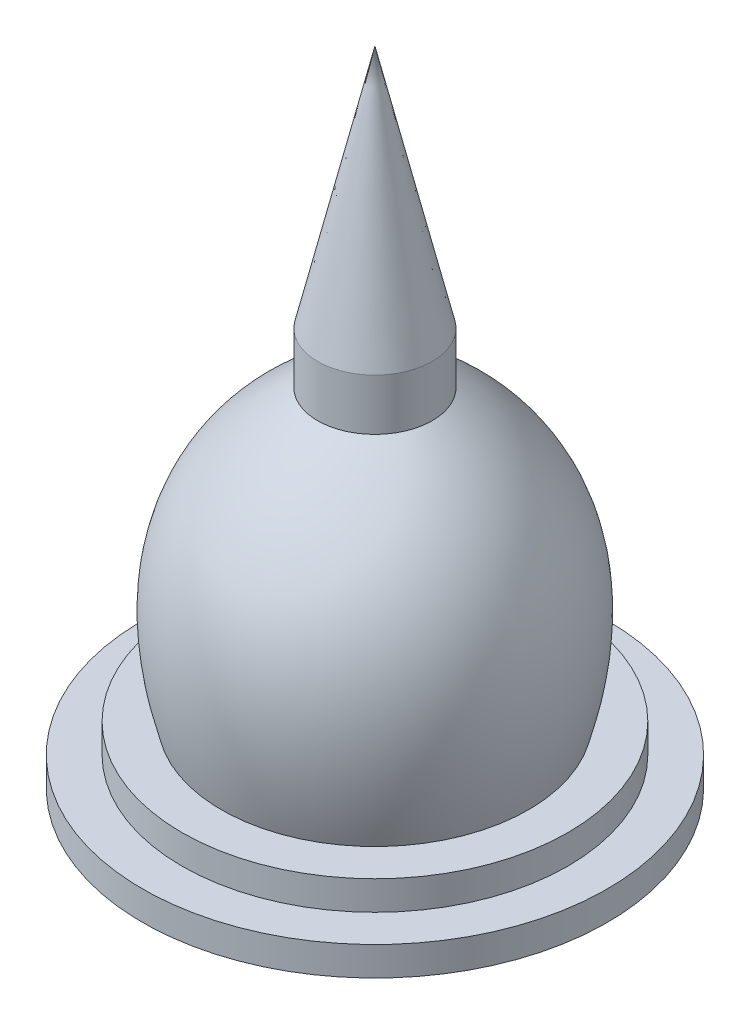
ISO-10303-21;
HEADER;
FILE_DESCRIPTION(('STEP AP214'),'2;1');
FILE_NAME('part.step','',(''),(''),'','','');
FILE_SCHEMA(('AUTOMOTIVE_DESIGN { 1 0 10303 214 1 1 1 1 }'));
ENDSEC;
DATA;
#1=APPLICATION_CONTEXT('core data for automotive mechanical design processes');
#2=APPLICATION_PROTOCOL_DEFINITION('international standard','automotive_design',2000,#1);
#3=PRODUCT_CONTEXT('',#1,'mechanical');
#4=PRODUCT('Part','Part','',(#3));
#5=PRODUCT_RELATED_PRODUCT_CATEGORY('part','',(#4));
#6=PRODUCT_DEFINITION_FORMATION('','',#4);
#7=PRODUCT_DEFINITION_CONTEXT('part definition',#1,'design');
#8=PRODUCT_DEFINITION('design','',#6,#7);
#9=PRODUCT_DEFINITION_SHAPE('','',#8);
#10=(LENGTH_UNIT() NAMED_UNIT(*) SI_UNIT(.MILLI.,.METRE.));
#11=(NAMED_UNIT(*) PLANE_ANGLE_UNIT() SI_UNIT($,.RADIAN.));
#12=(NAMED_UNIT(*) SI_UNIT($,.STERADIAN.) SOLID_ANGLE_UNIT());
#13=UNCERTAINTY_MEASURE_WITH_UNIT(LENGTH_MEASURE(1.E-05),#10,'distance_accuracy_value','');
#14=(GEOMETRIC_REPRESENTATION_CONTEXT(3) GLOBAL_UNCERTAINTY_ASSIGNED_CONTEXT((#13)) GLOBAL_UNIT_ASSIGNED_CONTEXT((#10,
#11,#12)) REPRESENTATION_CONTEXT('',''));
#15=CARTESIAN_POINT('',(0.,0.,0.));
#16=DIRECTION('',(0.,0.,1.));
#17=DIRECTION('',(1.,0.,0.));
#18=AXIS2_PLACEMENT_3D('',#15,#16,#17);
#19=CARTESIAN_POINT('',(-118.909502295578,-31.4918005815589,6.90444602269268E-05));
#20=CARTESIAN_POINT('',(-161.528042418388,117.899725874053,6.90444602269268E-05));
#21=CARTESIAN_POINT('',(-44.4234505234384,192.284239628368,6.90444602269268E-05));
#22=B_SPLINE_CURVE_WITH_KNOTS('',2,(#19,#20,#21),.UNSPECIFIED.,.F.,.F.,(3,3),(0.,1.),.UNSPECIFIED.);
#23=CARTESIAN_POINT('',(0.,-76.502097549297,6.90444602269268E-05));
#24=DIRECTION('',(0.,-1.,0.));
#25=AXIS1_PLACEMENT('',#23,#24);
#26=SURFACE_OF_REVOLUTION('',#22,#25);
#27=CARTESIAN_POINT('',(0.,192.284239628368,6.90444602269268E-05));
#28=DIRECTION('',(0.,-1.,0.));
#29=DIRECTION('',(0.,0.,-1.));
#30=AXIS2_PLACEMENT_3D('',#27,#28,#29);
#31=CIRCLE('',#30,44.4234505234384);
#32=CARTESIAN_POINT('',(0.,192.284239628368,-44.4233814789782));
#33=VERTEX_POINT('',#32);
#34=EDGE_CURVE('E59',#33,#33,#31,.T.);
#35=ORIENTED_EDGE('',*,*,#34,.T.);
#36=EDGE_LOOP('',(#35));
#37=FACE_BOUND('',#36,.T.);
#38=CARTESIAN_POINT('',(0.,-31.4918005815589,6.90444602269268E-05));
#39=DIRECTION('',(0.,-1.,0.));
#40=DIRECTION('',(0.,0.,-1.));
#41=AXIS2_PLACEMENT_3D('',#38,#39,#40);
#42=CIRCLE('',#41,118.909502295578);
#43=CARTESIAN_POINT('',(0.,-31.4918005815589,-118.909433251118));
#44=VERTEX_POINT('',#43);
#45=EDGE_CURVE('E11',#44,#44,#42,.T.);
#46=ORIENTED_EDGE('',*,*,#45,.F.);
#47=EDGE_LOOP('',(#46));
#48=FACE_BOUND('',#47,.T.);
#49=ADVANCED_FACE('F38',(#37,#48),#26,.F.);
#50=CARTESIAN_POINT('',(0.,-31.4918005815589,6.90444602269268E-05));
#51=DIRECTION('',(0.,1.,0.));
#52=DIRECTION('',(0.,0.,1.));
#53=AXIS2_PLACEMENT_3D('',#50,#51,#52);
#54=PLANE('',#53);
#55=ORIENTED_EDGE('',*,*,#45,.T.);
#56=EDGE_LOOP('',(#55));
#57=FACE_BOUND('',#56,.T.);
#58=CARTESIAN_POINT('',(0.,-31.4918005815589,6.90444602269268E-05));
#59=DIRECTION('',(0.,-1.,0.));
#60=DIRECTION('',(0.,0.,-1.));
#61=AXIS2_PLACEMENT_3D('',#58,#59,#60);
#62=CIRCLE('',#61,149.45475124421);
#63=CARTESIAN_POINT('',(0.,-31.4918005815589,-149.45468219975));
#64=VERTEX_POINT('',#63);
#65=EDGE_CURVE('E45',#64,#64,#62,.T.);
#66=ORIENTED_EDGE('',*,*,#65,.F.);
#67=EDGE_LOOP('',(#66));
#68=FACE_BOUND('',#67,.T.);
#69=ADVANCED_FACE('F76',(#57,#68),#54,.T.);
#70=CARTESIAN_POINT('',(0.,-76.502097549297,6.90444602269268E-05));
#71=DIRECTION('',(0.,-1.,0.));
#72=DIRECTION('',(0.,0.,-1.));
#73=AXIS2_PLACEMENT_3D('',#70,#71,#72);
#74=CYLINDRICAL_SURFACE('',#73,149.45475124421);
#75=CARTESIAN_POINT('',(0.,-53.9952329041527,6.90444602269268E-05));
#76=DIRECTION('',(0.,-1.,0.));
#77=DIRECTION('',(0.,0.,-1.));
#78=AXIS2_PLACEMENT_3D('',#75,#76,#77);
#79=CIRCLE('',#78,149.45475124421);
#80=CARTESIAN_POINT('',(0.,-53.9952329041527,-149.45468219975));
#81=VERTEX_POINT('',#80);
#82=EDGE_CURVE('E69',#81,#81,#79,.T.);
#83=ORIENTED_EDGE('',*,*,#82,.F.);
#84=EDGE_LOOP('',(#83));
#85=FACE_BOUND('',#84,.T.);
#86=ORIENTED_EDGE('',*,*,#65,.T.);
#87=EDGE_LOOP('',(#86));
#88=FACE_BOUND('',#87,.T.);
#89=ADVANCED_FACE('F74',(#85,#88),#74,.T.);
#90=CARTESIAN_POINT('',(0.,-53.9952329041527,6.90444602269268E-05));
#91=DIRECTION('',(0.,-1.,0.));
#92=DIRECTION('',(0.,0.,-1.));
#93=AXIS2_PLACEMENT_3D('',#90,#91,#92);
#94=CONICAL_SURFACE('',#93,149.45475124421,1.57068395833578);
#95=CARTESIAN_POINT('',(0.,-53.9986652267032,6.90444602269268E-05));
#96=DIRECTION('',(0.,-1.,0.));
#97=DIRECTION('',(0.,0.,-1.));
#98=AXIS2_PLACEMENT_3D('',#95,#96,#97);
#99=CIRCLE('',#98,180.);
#100=CARTESIAN_POINT('',(0.,-53.9986652267032,-179.99993095554));
#101=VERTEX_POINT('',#100);
#102=EDGE_CURVE('E62',#101,#101,#99,.T.);
#103=ORIENTED_EDGE('',*,*,#102,.F.);
#104=EDGE_LOOP('',(#103));
#105=FACE_BOUND('',#104,.T.);
#106=ORIENTED_EDGE('',*,*,#82,.T.);
#107=EDGE_LOOP('',(#106));
#108=FACE_BOUND('',#107,.T.);
#109=ADVANCED_FACE('F83',(#105,#108),#94,.T.);
#110=CARTESIAN_POINT('',(0.,-76.502097549297,6.90444602269268E-05));
#111=DIRECTION('',(0.,-1.,0.));
#112=DIRECTION('',(0.,0.,-1.));
#113=AXIS2_PLACEMENT_3D('',#110,#111,#112);
#114=CYLINDRICAL_SURFACE('',#113,180.);
#115=ORIENTED_EDGE('',*,*,#102,.T.);
#116=EDGE_LOOP('',(#115));
#117=FACE_BOUND('',#116,.T.);
#118=CARTESIAN_POINT('',(0.,-76.502097549297,6.90444602269268E-05));
#119=DIRECTION('',(0.,-1.,0.));
#120=DIRECTION('',(0.,0.,-1.));
#121=AXIS2_PLACEMENT_3D('',#118,#119,#120);
#122=CIRCLE('',#121,180.);
#123=CARTESIAN_POINT('',(0.,-76.502097549297,-179.99993095554));
#124=VERTEX_POINT('',#123);
#125=EDGE_CURVE('E58',#124,#124,#122,.T.);
#126=ORIENTED_EDGE('',*,*,#125,.F.);
#127=EDGE_LOOP('',(#126));
#128=FACE_BOUND('',#127,.T.);
#129=ADVANCED_FACE('F91',(#117,#128),#114,.T.);
#130=CARTESIAN_POINT('',(0.,-76.502097549297,6.90444602269268E-05));
#131=DIRECTION('',(0.,-1.,0.));
#132=DIRECTION('',(0.,0.,-1.));
#133=AXIS2_PLACEMENT_3D('',#130,#131,#132);
#134=PLANE('',#133);
#135=ORIENTED_EDGE('',*,*,#125,.T.);
#136=EDGE_LOOP('',(#135));
#137=FACE_BOUND('',#136,.T.);
#138=ADVANCED_FACE('F52',(#137),#134,.T.);
#139=CARTESIAN_POINT('',(0.,232.069264862423,6.90444602269268E-05));
#140=DIRECTION('',(0.,-1.,0.));
#141=DIRECTION('',(0.,0.,-1.));
#142=AXIS2_PLACEMENT_3D('',#139,#140,#141);
#143=CONICAL_SURFACE('',#142,44.4234505234384,0.230440107254821);
#144=CARTESIAN_POINT('',(0.,421.421365571114,6.90444602269268E-05));
#145=VERTEX_POINT('',#144);
#146=VERTEX_LOOP('',#145);
#147=FACE_BOUND('',#146,.T.);
#148=CARTESIAN_POINT('',(0.,232.069264862423,6.90444602269268E-05));
#149=DIRECTION('',(0.,-1.,0.));
#150=DIRECTION('',(0.,0.,-1.));
#151=AXIS2_PLACEMENT_3D('',#148,#149,#150);
#152=CIRCLE('',#151,44.4234505234384);
#153=CARTESIAN_POINT('',(0.,232.069264862423,-44.4233814789782));
#154=VERTEX_POINT('',#153);
#155=EDGE_CURVE('E56',#154,#154,#152,.T.);
#156=ORIENTED_EDGE('',*,*,#155,.F.);
#157=EDGE_LOOP('',(#156));
#158=FACE_BOUND('',#157,.T.);
#159=ADVANCED_FACE('F48',(#147,#158),#143,.T.);
#160=CARTESIAN_POINT('',(0.,-76.502097549297,6.90444602269268E-05));
#161=DIRECTION('',(0.,-1.,0.));
#162=DIRECTION('',(0.,0.,-1.));
#163=AXIS2_PLACEMENT_3D('',#160,#161,#162);
#164=CYLINDRICAL_SURFACE('',#163,44.4234505234384);
#165=ORIENTED_EDGE('',*,*,#155,.T.);
#166=EDGE_LOOP('',(#165));
#167=FACE_BOUND('',#166,.T.);
#168=ORIENTED_EDGE('',*,*,#34,.F.);
#169=EDGE_LOOP('',(#168));
#170=FACE_BOUND('',#169,.T.);
#171=ADVANCED_FACE('F51',(#167,#170),#164,.T.);
#172=CLOSED_SHELL('',(#49,#69,#89,#109,#129,#138,#159,#171));
#173=MANIFOLD_SOLID_BREP('B2',#172);
#174=ADVANCED_BREP_SHAPE_REPRESENTATION('',(#18,#173),#14);
#175=SHAPE_DEFINITION_REPRESENTATION(#9,#174);
ENDSEC;
END-ISO-10303-21;
